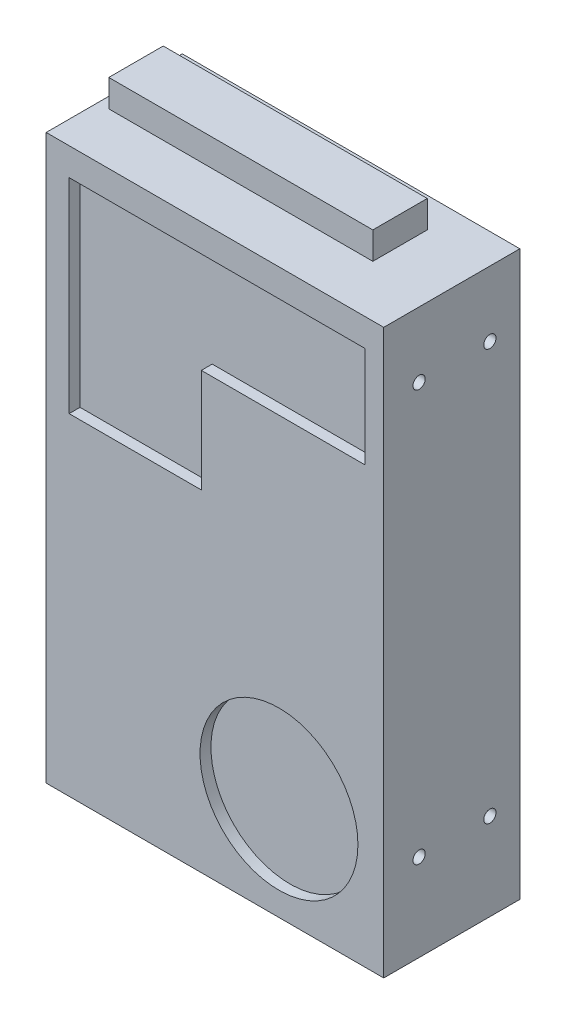
ISO-10303-21;
HEADER;
FILE_DESCRIPTION(('STEP AP214'),'2;1');
FILE_NAME('part.step','',(''),(''),'','','');
FILE_SCHEMA(('AUTOMOTIVE_DESIGN { 1 0 10303 214 1 1 1 1 }'));
ENDSEC;
DATA;
#1=APPLICATION_CONTEXT('core data for automotive mechanical design processes');
#2=APPLICATION_PROTOCOL_DEFINITION('international standard','automotive_design',2000,#1);
#3=PRODUCT_CONTEXT('',#1,'mechanical');
#4=PRODUCT('Part','Part','',(#3));
#5=PRODUCT_RELATED_PRODUCT_CATEGORY('part','',(#4));
#6=PRODUCT_DEFINITION_FORMATION('','',#4);
#7=PRODUCT_DEFINITION_CONTEXT('part definition',#1,'design');
#8=PRODUCT_DEFINITION('design','',#6,#7);
#9=PRODUCT_DEFINITION_SHAPE('','',#8);
#10=(LENGTH_UNIT() NAMED_UNIT(*) SI_UNIT(.MILLI.,.METRE.));
#11=(NAMED_UNIT(*) PLANE_ANGLE_UNIT() SI_UNIT($,.RADIAN.));
#12=(NAMED_UNIT(*) SI_UNIT($,.STERADIAN.) SOLID_ANGLE_UNIT());
#13=UNCERTAINTY_MEASURE_WITH_UNIT(LENGTH_MEASURE(1.E-05),#10,'distance_accuracy_value','');
#14=(GEOMETRIC_REPRESENTATION_CONTEXT(3) GLOBAL_UNCERTAINTY_ASSIGNED_CONTEXT((#13)) GLOBAL_UNIT_ASSIGNED_CONTEXT((#10,
#11,#12)) REPRESENTATION_CONTEXT('',''));
#15=CARTESIAN_POINT('',(0.,0.,0.));
#16=DIRECTION('',(0.,0.,1.));
#17=DIRECTION('',(1.,0.,0.));
#18=AXIS2_PLACEMENT_3D('',#15,#16,#17);
#19=CARTESIAN_POINT('',(-25.0000000000016,-80.5,15.));
#20=DIRECTION('',(0.,0.,-1.));
#21=DIRECTION('',(-1.,0.,0.));
#22=AXIS2_PLACEMENT_3D('',#19,#20,#21);
#23=CYLINDRICAL_SURFACE('',#22,2.25);
#24=CARTESIAN_POINT('',(-25.0000000000016,-80.5,0.));
#25=DIRECTION('',(0.,0.,-1.));
#26=DIRECTION('',(-1.,0.,0.));
#27=AXIS2_PLACEMENT_3D('',#24,#25,#26);
#28=CIRCLE('',#27,2.25);
#29=CARTESIAN_POINT('',(-27.2500000000016,-80.5,0.));
#30=VERTEX_POINT('',#29);
#31=EDGE_CURVE('E314',#30,#30,#28,.T.);
#32=ORIENTED_EDGE('',*,*,#31,.T.);
#33=EDGE_LOOP('',(#32));
#34=FACE_BOUND('',#33,.T.);
#35=CARTESIAN_POINT('',(-25.0000000000016,-80.5,11.0000000000016));
#36=DIRECTION('',(0.707106781186547,0.,-0.707106781186547));
#37=DIRECTION('',(-0.707106781186547,0.,-0.707106781186547));
#38=AXIS2_PLACEMENT_3D('',#35,#36,#37);
#39=ELLIPSE('',#38,3.18198051533947,2.25);
#40=CARTESIAN_POINT('',(-25.0000000000016,-78.25,11.0000000000016));
#41=VERTEX_POINT('',#40);
#42=CARTESIAN_POINT('',(-25.0000000000016,-82.75,11.0000000000016));
#43=VERTEX_POINT('',#42);
#44=EDGE_CURVE('E47',#41,#43,#39,.F.);
#45=ORIENTED_EDGE('',*,*,#44,.T.);
#46=CARTESIAN_POINT('',(-25.0000000000016,-80.5,11.0000000000016));
#47=DIRECTION('',(-0.707106781186547,0.,-0.707106781186547));
#48=DIRECTION('',(0.707106781186547,0.,-0.707106781186547));
#49=AXIS2_PLACEMENT_3D('',#46,#47,#48);
#50=ELLIPSE('',#49,3.18198051533947,2.25);
#51=EDGE_CURVE('E352',#43,#41,#50,.F.);
#52=ORIENTED_EDGE('',*,*,#51,.T.);
#53=EDGE_LOOP('',(#45,#52));
#54=FACE_BOUND('',#53,.T.);
#55=ADVANCED_FACE('F33',(#34,#54),#23,.F.);
#56=CARTESIAN_POINT('',(24.9999999999984,-80.5,15.));
#57=DIRECTION('',(0.,0.,-1.));
#58=DIRECTION('',(-1.,0.,0.));
#59=AXIS2_PLACEMENT_3D('',#56,#57,#58);
#60=CYLINDRICAL_SURFACE('',#59,2.25);
#61=CARTESIAN_POINT('',(24.9999999999984,-80.5,0.));
#62=DIRECTION('',(0.,0.,-1.));
#63=DIRECTION('',(-1.,0.,0.));
#64=AXIS2_PLACEMENT_3D('',#61,#62,#63);
#65=CIRCLE('',#64,2.25);
#66=CARTESIAN_POINT('',(22.7499999999984,-80.5,0.));
#67=VERTEX_POINT('',#66);
#68=EDGE_CURVE('E320',#67,#67,#65,.T.);
#69=ORIENTED_EDGE('',*,*,#68,.T.);
#70=EDGE_LOOP('',(#69));
#71=FACE_BOUND('',#70,.T.);
#72=CARTESIAN_POINT('',(24.9999999999984,-80.5,11.0000000000016));
#73=DIRECTION('',(0.707106781186547,0.,-0.707106781186547));
#74=DIRECTION('',(-0.707106781186547,0.,-0.707106781186547));
#75=AXIS2_PLACEMENT_3D('',#72,#73,#74);
#76=ELLIPSE('',#75,3.18198051533947,2.25);
#77=CARTESIAN_POINT('',(24.9999999999984,-78.25,11.0000000000016));
#78=VERTEX_POINT('',#77);
#79=CARTESIAN_POINT('',(24.9999999999984,-82.75,11.0000000000016));
#80=VERTEX_POINT('',#79);
#81=EDGE_CURVE('E53',#78,#80,#76,.F.);
#82=ORIENTED_EDGE('',*,*,#81,.T.);
#83=CARTESIAN_POINT('',(24.9999999999984,-80.5,11.0000000000016));
#84=DIRECTION('',(-0.707106781186547,0.,-0.707106781186547));
#85=DIRECTION('',(0.707106781186547,0.,-0.707106781186547));
#86=AXIS2_PLACEMENT_3D('',#83,#84,#85);
#87=ELLIPSE('',#86,3.18198051533947,2.25);
#88=EDGE_CURVE('E11',#80,#78,#87,.F.);
#89=ORIENTED_EDGE('',*,*,#88,.T.);
#90=EDGE_LOOP('',(#82,#89));
#91=FACE_BOUND('',#90,.T.);
#92=ADVANCED_FACE('F169',(#71,#91),#60,.F.);
#93=CARTESIAN_POINT('',(25.,70.5,15.));
#94=DIRECTION('',(0.,0.,-1.));
#95=DIRECTION('',(-1.,0.,0.));
#96=AXIS2_PLACEMENT_3D('',#93,#94,#95);
#97=CYLINDRICAL_SURFACE('',#96,2.25);
#98=CARTESIAN_POINT('',(25.,70.5,0.));
#99=DIRECTION('',(0.,0.,-1.));
#100=DIRECTION('',(-1.,0.,0.));
#101=AXIS2_PLACEMENT_3D('',#98,#99,#100);
#102=CIRCLE('',#101,2.25);
#103=CARTESIAN_POINT('',(22.75,70.5,0.));
#104=VERTEX_POINT('',#103);
#105=EDGE_CURVE('E302',#104,#104,#102,.T.);
#106=ORIENTED_EDGE('',*,*,#105,.T.);
#107=EDGE_LOOP('',(#106));
#108=FACE_BOUND('',#107,.T.);
#109=CARTESIAN_POINT('',(25.,70.5,11.));
#110=DIRECTION('',(0.707106781186547,0.,-0.707106781186547));
#111=DIRECTION('',(-0.707106781186547,0.,-0.707106781186547));
#112=AXIS2_PLACEMENT_3D('',#109,#110,#111);
#113=ELLIPSE('',#112,3.18198051533947,2.25);
#114=CARTESIAN_POINT('',(25.,72.75,11.));
#115=VERTEX_POINT('',#114);
#116=CARTESIAN_POINT('',(25.,68.25,11.));
#117=VERTEX_POINT('',#116);
#118=EDGE_CURVE('E334',#115,#117,#113,.F.);
#119=ORIENTED_EDGE('',*,*,#118,.T.);
#120=CARTESIAN_POINT('',(25.,70.5,11.));
#121=DIRECTION('',(-0.707106781186547,0.,-0.707106781186547));
#122=DIRECTION('',(0.707106781186547,0.,-0.707106781186547));
#123=AXIS2_PLACEMENT_3D('',#120,#121,#122);
#124=ELLIPSE('',#123,3.18198051533947,2.25);
#125=EDGE_CURVE('E323',#117,#115,#124,.F.);
#126=ORIENTED_EDGE('',*,*,#125,.T.);
#127=EDGE_LOOP('',(#119,#126));
#128=FACE_BOUND('',#127,.T.);
#129=ADVANCED_FACE('F393',(#108,#128),#97,.F.);
#130=CARTESIAN_POINT('',(-25.,70.5,15.));
#131=DIRECTION('',(0.,0.,-1.));
#132=DIRECTION('',(-1.,0.,0.));
#133=AXIS2_PLACEMENT_3D('',#130,#131,#132);
#134=CYLINDRICAL_SURFACE('',#133,2.25);
#135=CARTESIAN_POINT('',(-25.,70.5,0.));
#136=DIRECTION('',(0.,0.,-1.));
#137=DIRECTION('',(-1.,0.,0.));
#138=AXIS2_PLACEMENT_3D('',#135,#136,#137);
#139=CIRCLE('',#138,2.25);
#140=CARTESIAN_POINT('',(-27.25,70.5,0.));
#141=VERTEX_POINT('',#140);
#142=EDGE_CURVE('E308',#141,#141,#139,.T.);
#143=ORIENTED_EDGE('',*,*,#142,.T.);
#144=EDGE_LOOP('',(#143));
#145=FACE_BOUND('',#144,.T.);
#146=CARTESIAN_POINT('',(-25.,70.5,11.));
#147=DIRECTION('',(0.707106781186547,0.,-0.707106781186547));
#148=DIRECTION('',(-0.707106781186547,0.,-0.707106781186547));
#149=AXIS2_PLACEMENT_3D('',#146,#147,#148);
#150=ELLIPSE('',#149,3.18198051533947,2.25);
#151=CARTESIAN_POINT('',(-25.,72.75,11.));
#152=VERTEX_POINT('',#151);
#153=CARTESIAN_POINT('',(-25.,68.25,11.));
#154=VERTEX_POINT('',#153);
#155=EDGE_CURVE('E181',#152,#154,#150,.F.);
#156=ORIENTED_EDGE('',*,*,#155,.T.);
#157=CARTESIAN_POINT('',(-25.,70.5,11.));
#158=DIRECTION('',(-0.707106781186547,0.,-0.707106781186547));
#159=DIRECTION('',(0.707106781186547,0.,-0.707106781186547));
#160=AXIS2_PLACEMENT_3D('',#157,#158,#159);
#161=ELLIPSE('',#160,3.18198051533947,2.25);
#162=EDGE_CURVE('E167',#154,#152,#161,.F.);
#163=ORIENTED_EDGE('',*,*,#162,.T.);
#164=EDGE_LOOP('',(#156,#163));
#165=FACE_BOUND('',#164,.T.);
#166=ADVANCED_FACE('F472',(#145,#165),#134,.F.);
#167=CARTESIAN_POINT('',(-72.019317075191,94.5,0.));
#168=DIRECTION('',(0.,-1.,0.));
#169=DIRECTION('',(0.,0.,-1.));
#170=AXIS2_PLACEMENT_3D('',#167,#168,#169);
#171=PLANE('',#170);
#172=DIRECTION('',(1.,0.,0.));
#173=VECTOR('',#172,1.);
#174=CARTESIAN_POINT('',(0.,94.5,0.));
#175=LINE('',#174,#173);
#176=CARTESIAN_POINT('',(-62.,94.5,0.));
#177=VERTEX_POINT('',#176);
#178=CARTESIAN_POINT('',(62.,94.5,0.));
#179=VERTEX_POINT('',#178);
#180=EDGE_CURVE('E183',#177,#179,#175,.T.);
#181=ORIENTED_EDGE('',*,*,#180,.F.);
#182=DIRECTION('',(0.,0.,-1.));
#183=VECTOR('',#182,1.);
#184=CARTESIAN_POINT('',(-62.,94.5,50.));
#185=LINE('',#184,#183);
#186=CARTESIAN_POINT('',(-62.,94.5,50.));
#187=VERTEX_POINT('',#186);
#188=EDGE_CURVE('E209',#187,#177,#185,.T.);
#189=ORIENTED_EDGE('',*,*,#188,.F.);
#190=DIRECTION('',(1.,0.,0.));
#191=VECTOR('',#190,1.);
#192=CARTESIAN_POINT('',(-72.019317075191,94.5,50.));
#193=LINE('',#192,#191);
#194=CARTESIAN_POINT('',(62.,94.5,50.));
#195=VERTEX_POINT('',#194);
#196=EDGE_CURVE('E212',#187,#195,#193,.T.);
#197=ORIENTED_EDGE('',*,*,#196,.T.);
#198=DIRECTION('',(0.,0.,1.));
#199=VECTOR('',#198,1.);
#200=CARTESIAN_POINT('',(62.,94.5,50.));
#201=LINE('',#200,#199);
#202=EDGE_CURVE('E201',#179,#195,#201,.T.);
#203=ORIENTED_EDGE('',*,*,#202,.F.);
#204=EDGE_LOOP('',(#181,#189,#197,#203));
#205=FACE_BOUND('',#204,.T.);
#206=DIRECTION('',(0.,0.,1.));
#207=VECTOR('',#206,1.);
#208=CARTESIAN_POINT('',(-58.,94.5,11.));
#209=LINE('',#208,#207);
#210=CARTESIAN_POINT('',(-58.,94.5,11.));
#211=VERTEX_POINT('',#210);
#212=CARTESIAN_POINT('',(-58.,94.5,31.));
#213=VERTEX_POINT('',#212);
#214=EDGE_CURVE('E237',#211,#213,#209,.T.);
#215=ORIENTED_EDGE('',*,*,#214,.F.);
#216=DIRECTION('',(-1.,0.,0.));
#217=VECTOR('',#216,1.);
#218=CARTESIAN_POINT('',(-58.,94.5,11.));
#219=LINE('',#218,#217);
#220=CARTESIAN_POINT('',(39.,94.5,11.));
#221=VERTEX_POINT('',#220);
#222=EDGE_CURVE('E227',#221,#211,#219,.T.);
#223=ORIENTED_EDGE('',*,*,#222,.F.);
#224=DIRECTION('',(0.,0.,-1.));
#225=VECTOR('',#224,1.);
#226=CARTESIAN_POINT('',(39.,94.5,11.));
#227=LINE('',#226,#225);
#228=CARTESIAN_POINT('',(39.,94.5,31.));
#229=VERTEX_POINT('',#228);
#230=EDGE_CURVE('E231',#229,#221,#227,.T.);
#231=ORIENTED_EDGE('',*,*,#230,.F.);
#232=DIRECTION('',(1.,0.,0.));
#233=VECTOR('',#232,1.);
#234=CARTESIAN_POINT('',(-58.,94.5,31.));
#235=LINE('',#234,#233);
#236=EDGE_CURVE('E234',#213,#229,#235,.T.);
#237=ORIENTED_EDGE('',*,*,#236,.F.);
#238=EDGE_LOOP('',(#215,#223,#231,#237));
#239=FACE_BOUND('',#238,.T.);
#240=ADVANCED_FACE('F450',(#205,#239),#171,.F.);
#241=CARTESIAN_POINT('',(62.,112.5,50.));
#242=DIRECTION('',(-1.,0.,0.));
#243=DIRECTION('',(0.,-1.,0.));
#244=AXIS2_PLACEMENT_3D('',#241,#242,#243);
#245=PLANE('',#244);
#246=CARTESIAN_POINT('',(62.,-80.5,11.0000000000016));
#247=DIRECTION('',(-1.,0.,0.));
#248=DIRECTION('',(0.,-1.,0.));
#249=AXIS2_PLACEMENT_3D('',#246,#247,#248);
#250=CIRCLE('',#249,2.25);
#251=CARTESIAN_POINT('',(62.,-82.75,11.0000000000016));
#252=VERTEX_POINT('',#251);
#253=EDGE_CURVE('E363',#252,#252,#250,.T.);
#254=ORIENTED_EDGE('',*,*,#253,.T.);
#255=EDGE_LOOP('',(#254));
#256=FACE_BOUND('',#255,.T.);
#257=CARTESIAN_POINT('',(62.,-80.5,37.0000000000016));
#258=DIRECTION('',(-1.,0.,0.));
#259=DIRECTION('',(0.,-1.,0.));
#260=AXIS2_PLACEMENT_3D('',#257,#258,#259);
#261=CIRCLE('',#260,2.25);
#262=CARTESIAN_POINT('',(62.,-82.75,37.0000000000016));
#263=VERTEX_POINT('',#262);
#264=EDGE_CURVE('E346',#263,#263,#261,.T.);
#265=ORIENTED_EDGE('',*,*,#264,.T.);
#266=EDGE_LOOP('',(#265));
#267=FACE_BOUND('',#266,.T.);
#268=CARTESIAN_POINT('',(62.,70.5,37.));
#269=DIRECTION('',(-1.,0.,0.));
#270=DIRECTION('',(0.,-1.,0.));
#271=AXIS2_PLACEMENT_3D('',#268,#269,#270);
#272=CIRCLE('',#271,2.25);
#273=CARTESIAN_POINT('',(62.,68.25,37.));
#274=VERTEX_POINT('',#273);
#275=EDGE_CURVE('E340',#274,#274,#272,.T.);
#276=ORIENTED_EDGE('',*,*,#275,.T.);
#277=EDGE_LOOP('',(#276));
#278=FACE_BOUND('',#277,.T.);
#279=CARTESIAN_POINT('',(62.,70.5,11.));
#280=DIRECTION('',(-1.,0.,0.));
#281=DIRECTION('',(0.,-1.,0.));
#282=AXIS2_PLACEMENT_3D('',#279,#280,#281);
#283=CIRCLE('',#282,2.25);
#284=CARTESIAN_POINT('',(62.,68.25,11.));
#285=VERTEX_POINT('',#284);
#286=EDGE_CURVE('E336',#285,#285,#283,.T.);
#287=ORIENTED_EDGE('',*,*,#286,.T.);
#288=EDGE_LOOP('',(#287));
#289=FACE_BOUND('',#288,.T.);
#290=DIRECTION('',(0.,1.,0.));
#291=VECTOR('',#290,1.);
#292=CARTESIAN_POINT('',(62.,112.5,0.));
#293=LINE('',#292,#291);
#294=CARTESIAN_POINT('',(62.,-112.5,0.));
#295=VERTEX_POINT('',#294);
#296=EDGE_CURVE('E198',#295,#179,#293,.T.);
#297=ORIENTED_EDGE('',*,*,#296,.T.);
#298=ORIENTED_EDGE('',*,*,#202,.T.);
#299=DIRECTION('',(0.,1.,0.));
#300=VECTOR('',#299,1.);
#301=CARTESIAN_POINT('',(62.,112.5,50.));
#302=LINE('',#301,#300);
#303=CARTESIAN_POINT('',(62.,-112.5,50.));
#304=VERTEX_POINT('',#303);
#305=EDGE_CURVE('E195',#304,#195,#302,.T.);
#306=ORIENTED_EDGE('',*,*,#305,.F.);
#307=DIRECTION('',(0.,0.,-1.));
#308=VECTOR('',#307,1.);
#309=CARTESIAN_POINT('',(62.,-112.5,50.));
#310=LINE('',#309,#308);
#311=EDGE_CURVE('E189',#304,#295,#310,.T.);
#312=ORIENTED_EDGE('',*,*,#311,.T.);
#313=EDGE_LOOP('',(#297,#298,#306,#312));
#314=FACE_BOUND('',#313,.T.);
#315=ADVANCED_FACE('F35',(#256,#267,#278,#289,#314),#245,.F.);
#316=CARTESIAN_POINT('',(-62.,112.5,50.));
#317=DIRECTION('',(1.,0.,0.));
#318=DIRECTION('',(0.,1.,0.));
#319=AXIS2_PLACEMENT_3D('',#316,#317,#318);
#320=PLANE('',#319);
#321=CARTESIAN_POINT('',(-62.,-80.5,11.0000000000016));
#322=DIRECTION('',(-1.,0.,0.));
#323=DIRECTION('',(0.,-1.,0.));
#324=AXIS2_PLACEMENT_3D('',#321,#322,#323);
#325=CIRCLE('',#324,2.25);
#326=CARTESIAN_POINT('',(-62.,-82.75,11.0000000000016));
#327=VERTEX_POINT('',#326);
#328=EDGE_CURVE('E364',#327,#327,#325,.T.);
#329=ORIENTED_EDGE('',*,*,#328,.F.);
#330=EDGE_LOOP('',(#329));
#331=FACE_BOUND('',#330,.T.);
#332=CARTESIAN_POINT('',(-62.,-80.5,37.0000000000016));
#333=DIRECTION('',(-1.,0.,0.));
#334=DIRECTION('',(0.,-1.,0.));
#335=AXIS2_PLACEMENT_3D('',#332,#333,#334);
#336=CIRCLE('',#335,2.25);
#337=CARTESIAN_POINT('',(-62.,-82.75,37.0000000000016));
#338=VERTEX_POINT('',#337);
#339=EDGE_CURVE('E349',#338,#338,#336,.T.);
#340=ORIENTED_EDGE('',*,*,#339,.F.);
#341=EDGE_LOOP('',(#340));
#342=FACE_BOUND('',#341,.T.);
#343=CARTESIAN_POINT('',(-62.,70.5,37.));
#344=DIRECTION('',(-1.,0.,0.));
#345=DIRECTION('',(0.,-1.,0.));
#346=AXIS2_PLACEMENT_3D('',#343,#344,#345);
#347=CIRCLE('',#346,2.25);
#348=CARTESIAN_POINT('',(-62.,68.25,37.));
#349=VERTEX_POINT('',#348);
#350=EDGE_CURVE('E343',#349,#349,#347,.T.);
#351=ORIENTED_EDGE('',*,*,#350,.F.);
#352=EDGE_LOOP('',(#351));
#353=FACE_BOUND('',#352,.T.);
#354=CARTESIAN_POINT('',(-62.,70.5,11.));
#355=DIRECTION('',(-1.,0.,0.));
#356=DIRECTION('',(0.,-1.,0.));
#357=AXIS2_PLACEMENT_3D('',#354,#355,#356);
#358=CIRCLE('',#357,2.25);
#359=CARTESIAN_POINT('',(-62.,68.25,11.));
#360=VERTEX_POINT('',#359);
#361=EDGE_CURVE('E337',#360,#360,#358,.T.);
#362=ORIENTED_EDGE('',*,*,#361,.F.);
#363=EDGE_LOOP('',(#362));
#364=FACE_BOUND('',#363,.T.);
#365=DIRECTION('',(0.,-1.,0.));
#366=VECTOR('',#365,1.);
#367=CARTESIAN_POINT('',(-62.,112.5,50.));
#368=LINE('',#367,#366);
#369=CARTESIAN_POINT('',(-62.,-112.5,50.));
#370=VERTEX_POINT('',#369);
#371=EDGE_CURVE('E203',#187,#370,#368,.T.);
#372=ORIENTED_EDGE('',*,*,#371,.F.);
#373=ORIENTED_EDGE('',*,*,#188,.T.);
#374=DIRECTION('',(0.,-1.,0.));
#375=VECTOR('',#374,1.);
#376=CARTESIAN_POINT('',(-62.,112.5,0.));
#377=LINE('',#376,#375);
#378=CARTESIAN_POINT('',(-62.,-112.5,0.));
#379=VERTEX_POINT('',#378);
#380=EDGE_CURVE('E196',#177,#379,#377,.T.);
#381=ORIENTED_EDGE('',*,*,#380,.T.);
#382=DIRECTION('',(0.,0.,-1.));
#383=VECTOR('',#382,1.);
#384=CARTESIAN_POINT('',(-62.,-112.5,50.));
#385=LINE('',#384,#383);
#386=EDGE_CURVE('E186',#370,#379,#385,.T.);
#387=ORIENTED_EDGE('',*,*,#386,.F.);
#388=EDGE_LOOP('',(#372,#373,#381,#387));
#389=FACE_BOUND('',#388,.T.);
#390=ADVANCED_FACE('F431',(#331,#342,#353,#364,#389),#320,.F.);
#391=CARTESIAN_POINT('',(-62.,-112.5,50.));
#392=DIRECTION('',(0.,1.,0.));
#393=DIRECTION('',(0.,0.,1.));
#394=AXIS2_PLACEMENT_3D('',#391,#392,#393);
#395=PLANE('',#394);
#396=DIRECTION('',(1.,0.,0.));
#397=VECTOR('',#396,1.);
#398=CARTESIAN_POINT('',(-62.,-112.5,0.));
#399=LINE('',#398,#397);
#400=EDGE_CURVE('E193',#379,#295,#399,.T.);
#401=ORIENTED_EDGE('',*,*,#400,.T.);
#402=ORIENTED_EDGE('',*,*,#311,.F.);
#403=DIRECTION('',(1.,0.,0.));
#404=VECTOR('',#403,1.);
#405=CARTESIAN_POINT('',(-62.,-112.5,50.));
#406=LINE('',#405,#404);
#407=EDGE_CURVE('E192',#370,#304,#406,.T.);
#408=ORIENTED_EDGE('',*,*,#407,.F.);
#409=ORIENTED_EDGE('',*,*,#386,.T.);
#410=EDGE_LOOP('',(#401,#402,#408,#409));
#411=FACE_BOUND('',#410,.T.);
#412=ADVANCED_FACE('F434',(#411),#395,.F.);
#413=CARTESIAN_POINT('',(0.,0.,50.));
#414=DIRECTION('',(0.,0.,1.));
#415=DIRECTION('',(1.,0.,0.));
#416=AXIS2_PLACEMENT_3D('',#413,#414,#415);
#417=PLANE('',#416);
#418=DIRECTION('',(0.,1.,0.));
#419=VECTOR('',#418,1.);
#420=CARTESIAN_POINT('',(-5.00532483606775,47.3045795696944,50.));
#421=LINE('',#420,#419);
#422=CARTESIAN_POINT('',(-5.00532483606775,9.26411081557963,50.));
#423=VERTEX_POINT('',#422);
#424=CARTESIAN_POINT('',(-5.00532483606775,47.3045795696944,50.));
#425=VERTEX_POINT('',#424);
#426=EDGE_CURVE('E283',#423,#425,#421,.T.);
#427=ORIENTED_EDGE('',*,*,#426,.F.);
#428=DIRECTION('',(1.,0.,0.));
#429=VECTOR('',#428,1.);
#430=CARTESIAN_POINT('',(-53.5569757459248,9.26411081557963,50.));
#431=LINE('',#430,#429);
#432=CARTESIAN_POINT('',(-53.5569757459248,9.26411081557963,50.));
#433=VERTEX_POINT('',#432);
#434=EDGE_CURVE('E267',#433,#423,#431,.T.);
#435=ORIENTED_EDGE('',*,*,#434,.F.);
#436=DIRECTION('',(0.,-1.,0.));
#437=VECTOR('',#436,1.);
#438=CARTESIAN_POINT('',(-53.5569757459248,84.3439833565956,50.));
#439=LINE('',#438,#437);
#440=CARTESIAN_POINT('',(-53.5569757459248,84.3439833565956,50.));
#441=VERTEX_POINT('',#440);
#442=EDGE_CURVE('E271',#441,#433,#439,.T.);
#443=ORIENTED_EDGE('',*,*,#442,.F.);
#444=DIRECTION('',(-1.,0.,0.));
#445=VECTOR('',#444,1.);
#446=CARTESIAN_POINT('',(-53.5569757459248,84.3439833565956,50.));
#447=LINE('',#446,#445);
#448=CARTESIAN_POINT('',(55.058573196745,84.3439833565956,50.));
#449=VERTEX_POINT('',#448);
#450=EDGE_CURVE('E274',#449,#441,#447,.T.);
#451=ORIENTED_EDGE('',*,*,#450,.F.);
#452=DIRECTION('',(0.,1.,0.));
#453=VECTOR('',#452,1.);
#454=CARTESIAN_POINT('',(55.058573196745,84.3439833565956,50.));
#455=LINE('',#454,#453);
#456=CARTESIAN_POINT('',(55.058573196745,47.3045795696944,50.));
#457=VERTEX_POINT('',#456);
#458=EDGE_CURVE('E277',#457,#449,#455,.T.);
#459=ORIENTED_EDGE('',*,*,#458,.F.);
#460=DIRECTION('',(1.,0.,0.));
#461=VECTOR('',#460,1.);
#462=CARTESIAN_POINT('',(-5.00532483606775,47.3045795696944,50.));
#463=LINE('',#462,#461);
#464=EDGE_CURVE('E280',#425,#457,#463,.T.);
#465=ORIENTED_EDGE('',*,*,#464,.F.);
#466=EDGE_LOOP('',(#427,#435,#443,#451,#459,#465));
#467=FACE_BOUND('',#466,.T.);
#468=CARTESIAN_POINT('',(23.5250267295183,-74.8253464303583,50.));
#469=DIRECTION('',(0.,0.,1.));
#470=DIRECTION('',(1.,0.,0.));
#471=AXIS2_PLACEMENT_3D('',#468,#469,#470);
#472=CIRCLE('',#471,29.);
#473=CARTESIAN_POINT('',(52.5250267295183,-74.8253464303583,50.));
#474=VERTEX_POINT('',#473);
#475=EDGE_CURVE('E248',#474,#474,#472,.T.);
#476=ORIENTED_EDGE('',*,*,#475,.F.);
#477=EDGE_LOOP('',(#476));
#478=FACE_BOUND('',#477,.T.);
#479=ORIENTED_EDGE('',*,*,#196,.F.);
#480=ORIENTED_EDGE('',*,*,#371,.T.);
#481=ORIENTED_EDGE('',*,*,#407,.T.);
#482=ORIENTED_EDGE('',*,*,#305,.T.);
#483=EDGE_LOOP('',(#479,#480,#481,#482));
#484=FACE_BOUND('',#483,.T.);
#485=ADVANCED_FACE('F446',(#467,#478,#484),#417,.T.);
#486=CARTESIAN_POINT('',(0.,0.,0.));
#487=DIRECTION('',(0.,0.,1.));
#488=DIRECTION('',(1.,0.,0.));
#489=AXIS2_PLACEMENT_3D('',#486,#487,#488);
#490=PLANE('',#489);
#491=ORIENTED_EDGE('',*,*,#68,.F.);
#492=EDGE_LOOP('',(#491));
#493=FACE_BOUND('',#492,.T.);
#494=ORIENTED_EDGE('',*,*,#31,.F.);
#495=EDGE_LOOP('',(#494));
#496=FACE_BOUND('',#495,.T.);
#497=ORIENTED_EDGE('',*,*,#142,.F.);
#498=EDGE_LOOP('',(#497));
#499=FACE_BOUND('',#498,.T.);
#500=ORIENTED_EDGE('',*,*,#105,.F.);
#501=EDGE_LOOP('',(#500));
#502=FACE_BOUND('',#501,.T.);
#503=ORIENTED_EDGE('',*,*,#380,.F.);
#504=ORIENTED_EDGE('',*,*,#180,.T.);
#505=ORIENTED_EDGE('',*,*,#296,.F.);
#506=ORIENTED_EDGE('',*,*,#400,.F.);
#507=EDGE_LOOP('',(#503,#504,#505,#506));
#508=FACE_BOUND('',#507,.T.);
#509=ADVANCED_FACE('F456',(#493,#496,#499,#502,#508),#490,.F.);
#510=CARTESIAN_POINT('',(-58.,104.5,11.));
#511=DIRECTION('',(1.,0.,0.));
#512=DIRECTION('',(0.,0.,-1.));
#513=AXIS2_PLACEMENT_3D('',#510,#511,#512);
#514=PLANE('',#513);
#515=ORIENTED_EDGE('',*,*,#214,.T.);
#516=DIRECTION('',(0.,-1.,0.));
#517=VECTOR('',#516,1.);
#518=CARTESIAN_POINT('',(-58.,104.5,31.));
#519=LINE('',#518,#517);
#520=CARTESIAN_POINT('',(-58.,104.5,31.));
#521=VERTEX_POINT('',#520);
#522=EDGE_CURVE('E214',#521,#213,#519,.T.);
#523=ORIENTED_EDGE('',*,*,#522,.F.);
#524=DIRECTION('',(0.,0.,1.));
#525=VECTOR('',#524,1.);
#526=CARTESIAN_POINT('',(-58.,104.5,11.));
#527=LINE('',#526,#525);
#528=CARTESIAN_POINT('',(-58.,104.5,11.));
#529=VERTEX_POINT('',#528);
#530=EDGE_CURVE('E230',#529,#521,#527,.T.);
#531=ORIENTED_EDGE('',*,*,#530,.F.);
#532=DIRECTION('',(0.,-1.,0.));
#533=VECTOR('',#532,1.);
#534=CARTESIAN_POINT('',(-58.,104.5,11.));
#535=LINE('',#534,#533);
#536=EDGE_CURVE('E223',#529,#211,#535,.T.);
#537=ORIENTED_EDGE('',*,*,#536,.T.);
#538=EDGE_LOOP('',(#515,#523,#531,#537));
#539=FACE_BOUND('',#538,.T.);
#540=ADVANCED_FACE('F467',(#539),#514,.F.);
#541=CARTESIAN_POINT('',(-58.,104.5,31.));
#542=DIRECTION('',(0.,0.,-1.));
#543=DIRECTION('',(-1.,0.,0.));
#544=AXIS2_PLACEMENT_3D('',#541,#542,#543);
#545=PLANE('',#544);
#546=ORIENTED_EDGE('',*,*,#236,.T.);
#547=DIRECTION('',(0.,-1.,0.));
#548=VECTOR('',#547,1.);
#549=CARTESIAN_POINT('',(39.,104.5,31.));
#550=LINE('',#549,#548);
#551=CARTESIAN_POINT('',(39.,104.5,31.));
#552=VERTEX_POINT('',#551);
#553=EDGE_CURVE('E217',#552,#229,#550,.T.);
#554=ORIENTED_EDGE('',*,*,#553,.F.);
#555=DIRECTION('',(1.,0.,0.));
#556=VECTOR('',#555,1.);
#557=CARTESIAN_POINT('',(-58.,104.5,31.));
#558=LINE('',#557,#556);
#559=EDGE_CURVE('E244',#521,#552,#558,.T.);
#560=ORIENTED_EDGE('',*,*,#559,.F.);
#561=ORIENTED_EDGE('',*,*,#522,.T.);
#562=EDGE_LOOP('',(#546,#554,#560,#561));
#563=FACE_BOUND('',#562,.T.);
#564=ADVANCED_FACE('F475',(#563),#545,.F.);
#565=CARTESIAN_POINT('',(39.,104.5,11.));
#566=DIRECTION('',(-1.,0.,0.));
#567=DIRECTION('',(0.,0.,1.));
#568=AXIS2_PLACEMENT_3D('',#565,#566,#567);
#569=PLANE('',#568);
#570=ORIENTED_EDGE('',*,*,#230,.T.);
#571=DIRECTION('',(0.,-1.,0.));
#572=VECTOR('',#571,1.);
#573=CARTESIAN_POINT('',(39.,104.5,11.));
#574=LINE('',#573,#572);
#575=CARTESIAN_POINT('',(39.,104.5,11.));
#576=VERTEX_POINT('',#575);
#577=EDGE_CURVE('E220',#576,#221,#574,.T.);
#578=ORIENTED_EDGE('',*,*,#577,.F.);
#579=DIRECTION('',(0.,0.,-1.));
#580=VECTOR('',#579,1.);
#581=CARTESIAN_POINT('',(39.,104.5,11.));
#582=LINE('',#581,#580);
#583=EDGE_CURVE('E242',#552,#576,#582,.T.);
#584=ORIENTED_EDGE('',*,*,#583,.F.);
#585=ORIENTED_EDGE('',*,*,#553,.T.);
#586=EDGE_LOOP('',(#570,#578,#584,#585));
#587=FACE_BOUND('',#586,.T.);
#588=ADVANCED_FACE('F479',(#587),#569,.F.);
#589=CARTESIAN_POINT('',(-58.,104.5,11.));
#590=DIRECTION('',(0.,0.,1.));
#591=DIRECTION('',(1.,0.,0.));
#592=AXIS2_PLACEMENT_3D('',#589,#590,#591);
#593=PLANE('',#592);
#594=ORIENTED_EDGE('',*,*,#222,.T.);
#595=ORIENTED_EDGE('',*,*,#536,.F.);
#596=DIRECTION('',(-1.,0.,0.));
#597=VECTOR('',#596,1.);
#598=CARTESIAN_POINT('',(-58.,104.5,11.));
#599=LINE('',#598,#597);
#600=EDGE_CURVE('E226',#576,#529,#599,.T.);
#601=ORIENTED_EDGE('',*,*,#600,.F.);
#602=ORIENTED_EDGE('',*,*,#577,.T.);
#603=EDGE_LOOP('',(#594,#595,#601,#602));
#604=FACE_BOUND('',#603,.T.);
#605=ADVANCED_FACE('F483',(#604),#593,.F.);
#606=CARTESIAN_POINT('',(0.,104.5,0.));
#607=DIRECTION('',(0.,1.,0.));
#608=DIRECTION('',(0.,0.,1.));
#609=AXIS2_PLACEMENT_3D('',#606,#607,#608);
#610=PLANE('',#609);
#611=ORIENTED_EDGE('',*,*,#530,.T.);
#612=ORIENTED_EDGE('',*,*,#559,.T.);
#613=ORIENTED_EDGE('',*,*,#583,.T.);
#614=ORIENTED_EDGE('',*,*,#600,.T.);
#615=EDGE_LOOP('',(#611,#612,#613,#614));
#616=FACE_BOUND('',#615,.T.);
#617=ADVANCED_FACE('F487',(#616),#610,.T.);
#618=CARTESIAN_POINT('',(23.5250267295183,-74.8253464303583,46.));
#619=DIRECTION('',(0.,0.,1.));
#620=DIRECTION('',(1.,0.,0.));
#621=AXIS2_PLACEMENT_3D('',#618,#619,#620);
#622=CYLINDRICAL_SURFACE('',#621,29.);
#623=CARTESIAN_POINT('',(23.5250267295183,-74.8253464303583,46.));
#624=DIRECTION('',(0.,0.,1.));
#625=DIRECTION('',(1.,0.,0.));
#626=AXIS2_PLACEMENT_3D('',#623,#624,#625);
#627=CIRCLE('',#626,29.);
#628=CARTESIAN_POINT('',(52.5250267295183,-74.8253464303583,46.));
#629=VERTEX_POINT('',#628);
#630=EDGE_CURVE('E240',#629,#629,#627,.T.);
#631=ORIENTED_EDGE('',*,*,#630,.F.);
#632=EDGE_LOOP('',(#631));
#633=FACE_BOUND('',#632,.T.);
#634=ORIENTED_EDGE('',*,*,#475,.T.);
#635=EDGE_LOOP('',(#634));
#636=FACE_BOUND('',#635,.T.);
#637=ADVANCED_FACE('F491',(#633,#636),#622,.F.);
#638=CARTESIAN_POINT('',(23.5250267295183,-74.8253464303583,46.));
#639=DIRECTION('',(0.,0.,1.));
#640=DIRECTION('',(1.,0.,0.));
#641=AXIS2_PLACEMENT_3D('',#638,#639,#640);
#642=PLANE('',#641);
#643=ORIENTED_EDGE('',*,*,#630,.T.);
#644=EDGE_LOOP('',(#643));
#645=FACE_BOUND('',#644,.T.);
#646=ADVANCED_FACE('F495',(#645),#642,.T.);
#647=CARTESIAN_POINT('',(-5.00532483606775,47.3045795696944,46.));
#648=DIRECTION('',(1.,0.,0.));
#649=DIRECTION('',(0.,0.,-1.));
#650=AXIS2_PLACEMENT_3D('',#647,#648,#649);
#651=PLANE('',#650);
#652=ORIENTED_EDGE('',*,*,#426,.T.);
#653=DIRECTION('',(0.,0.,1.));
#654=VECTOR('',#653,1.);
#655=CARTESIAN_POINT('',(-5.00532483606775,47.3045795696944,46.));
#656=LINE('',#655,#654);
#657=CARTESIAN_POINT('',(-5.00532483606775,47.3045795696944,46.));
#658=VERTEX_POINT('',#657);
#659=EDGE_CURVE('E254',#658,#425,#656,.T.);
#660=ORIENTED_EDGE('',*,*,#659,.F.);
#661=DIRECTION('',(0.,1.,0.));
#662=VECTOR('',#661,1.);
#663=CARTESIAN_POINT('',(-5.00532483606775,47.3045795696944,46.));
#664=LINE('',#663,#662);
#665=CARTESIAN_POINT('',(-5.00532483606775,9.26411081557963,46.));
#666=VERTEX_POINT('',#665);
#667=EDGE_CURVE('E270',#666,#658,#664,.T.);
#668=ORIENTED_EDGE('',*,*,#667,.F.);
#669=DIRECTION('',(0.,0.,1.));
#670=VECTOR('',#669,1.);
#671=CARTESIAN_POINT('',(-5.00532483606775,9.26411081557963,46.));
#672=LINE('',#671,#670);
#673=EDGE_CURVE('E251',#666,#423,#672,.T.);
#674=ORIENTED_EDGE('',*,*,#673,.T.);
#675=EDGE_LOOP('',(#652,#660,#668,#674));
#676=FACE_BOUND('',#675,.T.);
#677=ADVANCED_FACE('F499',(#676),#651,.F.);
#678=CARTESIAN_POINT('',(-53.5569757459248,9.26411081557963,46.));
#679=DIRECTION('',(0.,-1.,0.));
#680=DIRECTION('',(0.,0.,-1.));
#681=AXIS2_PLACEMENT_3D('',#678,#679,#680);
#682=PLANE('',#681);
#683=ORIENTED_EDGE('',*,*,#434,.T.);
#684=ORIENTED_EDGE('',*,*,#673,.F.);
#685=DIRECTION('',(1.,0.,0.));
#686=VECTOR('',#685,1.);
#687=CARTESIAN_POINT('',(-53.5569757459248,9.26411081557963,46.));
#688=LINE('',#687,#686);
#689=CARTESIAN_POINT('',(-53.5569757459248,9.26411081557963,46.));
#690=VERTEX_POINT('',#689);
#691=EDGE_CURVE('E258',#690,#666,#688,.T.);
#692=ORIENTED_EDGE('',*,*,#691,.F.);
#693=DIRECTION('',(0.,0.,1.));
#694=VECTOR('',#693,1.);
#695=CARTESIAN_POINT('',(-53.5569757459248,9.26411081557963,46.));
#696=LINE('',#695,#694);
#697=EDGE_CURVE('E264',#690,#433,#696,.T.);
#698=ORIENTED_EDGE('',*,*,#697,.T.);
#699=EDGE_LOOP('',(#683,#684,#692,#698));
#700=FACE_BOUND('',#699,.T.);
#701=ADVANCED_FACE('F503',(#700),#682,.F.);
#702=CARTESIAN_POINT('',(-53.5569757459248,84.3439833565956,46.));
#703=DIRECTION('',(-1.,0.,0.));
#704=DIRECTION('',(0.,0.,1.));
#705=AXIS2_PLACEMENT_3D('',#702,#703,#704);
#706=PLANE('',#705);
#707=ORIENTED_EDGE('',*,*,#442,.T.);
#708=ORIENTED_EDGE('',*,*,#697,.F.);
#709=DIRECTION('',(0.,-1.,0.));
#710=VECTOR('',#709,1.);
#711=CARTESIAN_POINT('',(-53.5569757459248,84.3439833565956,46.));
#712=LINE('',#711,#710);
#713=CARTESIAN_POINT('',(-53.5569757459248,84.3439833565956,46.));
#714=VERTEX_POINT('',#713);
#715=EDGE_CURVE('E288',#714,#690,#712,.T.);
#716=ORIENTED_EDGE('',*,*,#715,.F.);
#717=DIRECTION('',(0.,0.,1.));
#718=VECTOR('',#717,1.);
#719=CARTESIAN_POINT('',(-53.5569757459248,84.3439833565956,46.));
#720=LINE('',#719,#718);
#721=EDGE_CURVE('E262',#714,#441,#720,.T.);
#722=ORIENTED_EDGE('',*,*,#721,.T.);
#723=EDGE_LOOP('',(#707,#708,#716,#722));
#724=FACE_BOUND('',#723,.T.);
#725=ADVANCED_FACE('F517',(#724),#706,.F.);
#726=CARTESIAN_POINT('',(-53.5569757459248,84.3439833565956,46.));
#727=DIRECTION('',(0.,1.,0.));
#728=DIRECTION('',(0.,0.,1.));
#729=AXIS2_PLACEMENT_3D('',#726,#727,#728);
#730=PLANE('',#729);
#731=ORIENTED_EDGE('',*,*,#450,.T.);
#732=ORIENTED_EDGE('',*,*,#721,.F.);
#733=DIRECTION('',(-1.,0.,0.));
#734=VECTOR('',#733,1.);
#735=CARTESIAN_POINT('',(-53.5569757459248,84.3439833565956,46.));
#736=LINE('',#735,#734);
#737=CARTESIAN_POINT('',(55.058573196745,84.3439833565956,46.));
#738=VERTEX_POINT('',#737);
#739=EDGE_CURVE('E291',#738,#714,#736,.T.);
#740=ORIENTED_EDGE('',*,*,#739,.F.);
#741=DIRECTION('',(0.,0.,1.));
#742=VECTOR('',#741,1.);
#743=CARTESIAN_POINT('',(55.058573196745,84.3439833565956,46.));
#744=LINE('',#743,#742);
#745=EDGE_CURVE('E260',#738,#449,#744,.T.);
#746=ORIENTED_EDGE('',*,*,#745,.T.);
#747=EDGE_LOOP('',(#731,#732,#740,#746));
#748=FACE_BOUND('',#747,.T.);
#749=ADVANCED_FACE('F513',(#748),#730,.F.);
#750=CARTESIAN_POINT('',(55.058573196745,84.3439833565956,46.));
#751=DIRECTION('',(1.,0.,0.));
#752=DIRECTION('',(0.,0.,-1.));
#753=AXIS2_PLACEMENT_3D('',#750,#751,#752);
#754=PLANE('',#753);
#755=ORIENTED_EDGE('',*,*,#458,.T.);
#756=ORIENTED_EDGE('',*,*,#745,.F.);
#757=DIRECTION('',(0.,1.,0.));
#758=VECTOR('',#757,1.);
#759=CARTESIAN_POINT('',(55.058573196745,84.3439833565956,46.));
#760=LINE('',#759,#758);
#761=CARTESIAN_POINT('',(55.058573196745,47.3045795696944,46.));
#762=VERTEX_POINT('',#761);
#763=EDGE_CURVE('E294',#762,#738,#760,.T.);
#764=ORIENTED_EDGE('',*,*,#763,.F.);
#765=DIRECTION('',(0.,0.,1.));
#766=VECTOR('',#765,1.);
#767=CARTESIAN_POINT('',(55.058573196745,47.3045795696944,46.));
#768=LINE('',#767,#766);
#769=EDGE_CURVE('E257',#762,#457,#768,.T.);
#770=ORIENTED_EDGE('',*,*,#769,.T.);
#771=EDGE_LOOP('',(#755,#756,#764,#770));
#772=FACE_BOUND('',#771,.T.);
#773=ADVANCED_FACE('F509',(#772),#754,.F.);
#774=CARTESIAN_POINT('',(-5.00532483606775,47.3045795696944,46.));
#775=DIRECTION('',(0.,-1.,0.));
#776=DIRECTION('',(0.,0.,-1.));
#777=AXIS2_PLACEMENT_3D('',#774,#775,#776);
#778=PLANE('',#777);
#779=ORIENTED_EDGE('',*,*,#464,.T.);
#780=ORIENTED_EDGE('',*,*,#769,.F.);
#781=DIRECTION('',(1.,0.,0.));
#782=VECTOR('',#781,1.);
#783=CARTESIAN_POINT('',(-5.00532483606775,47.3045795696944,46.));
#784=LINE('',#783,#782);
#785=EDGE_CURVE('E297',#658,#762,#784,.T.);
#786=ORIENTED_EDGE('',*,*,#785,.F.);
#787=ORIENTED_EDGE('',*,*,#659,.T.);
#788=EDGE_LOOP('',(#779,#780,#786,#787));
#789=FACE_BOUND('',#788,.T.);
#790=ADVANCED_FACE('F505',(#789),#778,.F.);
#791=CARTESIAN_POINT('',(0.,0.,46.));
#792=DIRECTION('',(0.,0.,1.));
#793=DIRECTION('',(1.,0.,0.));
#794=AXIS2_PLACEMENT_3D('',#791,#792,#793);
#795=PLANE('',#794);
#796=ORIENTED_EDGE('',*,*,#667,.T.);
#797=ORIENTED_EDGE('',*,*,#785,.T.);
#798=ORIENTED_EDGE('',*,*,#763,.T.);
#799=ORIENTED_EDGE('',*,*,#739,.T.);
#800=ORIENTED_EDGE('',*,*,#715,.T.);
#801=ORIENTED_EDGE('',*,*,#691,.T.);
#802=EDGE_LOOP('',(#796,#797,#798,#799,#800,#801));
#803=FACE_BOUND('',#802,.T.);
#804=ADVANCED_FACE('F508',(#803),#795,.T.);
#805=CARTESIAN_POINT('',(62.,70.5,11.));
#806=DIRECTION('',(-1.,0.,0.));
#807=DIRECTION('',(0.,-1.,0.));
#808=AXIS2_PLACEMENT_3D('',#805,#806,#807);
#809=CYLINDRICAL_SURFACE('',#808,2.25);
#810=ORIENTED_EDGE('',*,*,#361,.T.);
#811=EDGE_LOOP('',(#810));
#812=FACE_BOUND('',#811,.T.);
#813=ORIENTED_EDGE('',*,*,#155,.F.);
#814=CARTESIAN_POINT('',(-25.,70.5,11.));
#815=DIRECTION('',(-0.707106781186547,0.,-0.707106781186547));
#816=DIRECTION('',(0.707106781186547,0.,-0.707106781186547));
#817=AXIS2_PLACEMENT_3D('',#814,#815,#816);
#818=ELLIPSE('',#817,3.18198051533947,2.25);
#819=EDGE_CURVE('E175',#154,#152,#818,.T.);
#820=ORIENTED_EDGE('',*,*,#819,.F.);
#821=EDGE_LOOP('',(#813,#820));
#822=FACE_BOUND('',#821,.T.);
#823=ADVANCED_FACE('F420',(#812,#822),#809,.F.);
#824=CARTESIAN_POINT('',(-25.,70.5,15.));
#825=DIRECTION('',(0.,0.,-1.));
#826=DIRECTION('',(-1.,0.,0.));
#827=AXIS2_PLACEMENT_3D('',#824,#825,#826);
#828=PLANE('',#827);
#829=CARTESIAN_POINT('',(-25.,70.5,15.));
#830=DIRECTION('',(0.,0.,-1.));
#831=DIRECTION('',(-1.,0.,0.));
#832=AXIS2_PLACEMENT_3D('',#829,#830,#831);
#833=CIRCLE('',#832,2.25);
#834=CARTESIAN_POINT('',(-27.25,70.5,15.));
#835=VERTEX_POINT('',#834);
#836=EDGE_CURVE('E305',#835,#835,#833,.T.);
#837=ORIENTED_EDGE('',*,*,#836,.T.);
#838=EDGE_LOOP('',(#837));
#839=FACE_BOUND('',#838,.T.);
#840=ADVANCED_FACE('F537',(#839),#828,.T.);
#841=CARTESIAN_POINT('',(-25.,70.5,11.));
#842=DIRECTION('',(0.707106781186547,0.,-0.707106781186547));
#843=DIRECTION('',(-0.707106781186547,0.,-0.707106781186547));
#844=AXIS2_PLACEMENT_3D('',#841,#842,#843);
#845=ELLIPSE('',#844,3.18198051533947,2.25);
#846=EDGE_CURVE('E178',#152,#154,#845,.T.);
#847=ORIENTED_EDGE('',*,*,#846,.T.);
#848=ORIENTED_EDGE('',*,*,#819,.T.);
#849=EDGE_LOOP('',(#847,#848));
#850=FACE_BOUND('',#849,.T.);
#851=ORIENTED_EDGE('',*,*,#836,.F.);
#852=EDGE_LOOP('',(#851));
#853=FACE_BOUND('',#852,.T.);
#854=ADVANCED_FACE('F535',(#850,#853),#134,.F.);
#855=ORIENTED_EDGE('',*,*,#846,.F.);
#856=ORIENTED_EDGE('',*,*,#162,.F.);
#857=EDGE_LOOP('',(#855,#856));
#858=FACE_BOUND('',#857,.T.);
#859=ORIENTED_EDGE('',*,*,#118,.F.);
#860=CARTESIAN_POINT('',(25.,70.5,11.));
#861=DIRECTION('',(-0.707106781186547,0.,-0.707106781186547));
#862=DIRECTION('',(0.707106781186547,0.,-0.707106781186547));
#863=AXIS2_PLACEMENT_3D('',#860,#861,#862);
#864=ELLIPSE('',#863,3.18198051533947,2.25);
#865=EDGE_CURVE('E328',#117,#115,#864,.T.);
#866=ORIENTED_EDGE('',*,*,#865,.F.);
#867=EDGE_LOOP('',(#859,#866));
#868=FACE_BOUND('',#867,.T.);
#869=ADVANCED_FACE('F419',(#858,#868),#809,.F.);
#870=CARTESIAN_POINT('',(25.,70.5,15.));
#871=DIRECTION('',(0.,0.,-1.));
#872=DIRECTION('',(-1.,0.,0.));
#873=AXIS2_PLACEMENT_3D('',#870,#871,#872);
#874=PLANE('',#873);
#875=CARTESIAN_POINT('',(25.,70.5,15.));
#876=DIRECTION('',(0.,0.,-1.));
#877=DIRECTION('',(-1.,0.,0.));
#878=AXIS2_PLACEMENT_3D('',#875,#876,#877);
#879=CIRCLE('',#878,2.25);
#880=CARTESIAN_POINT('',(22.75,70.5,15.));
#881=VERTEX_POINT('',#880);
#882=EDGE_CURVE('E285',#881,#881,#879,.T.);
#883=ORIENTED_EDGE('',*,*,#882,.T.);
#884=EDGE_LOOP('',(#883));
#885=FACE_BOUND('',#884,.T.);
#886=ADVANCED_FACE('F530',(#885),#874,.T.);
#887=CARTESIAN_POINT('',(25.,70.5,11.));
#888=DIRECTION('',(0.707106781186547,0.,-0.707106781186547));
#889=DIRECTION('',(-0.707106781186547,0.,-0.707106781186547));
#890=AXIS2_PLACEMENT_3D('',#887,#888,#889);
#891=ELLIPSE('',#890,3.18198051533947,2.25);
#892=EDGE_CURVE('E331',#115,#117,#891,.T.);
#893=ORIENTED_EDGE('',*,*,#892,.T.);
#894=ORIENTED_EDGE('',*,*,#865,.T.);
#895=EDGE_LOOP('',(#893,#894));
#896=FACE_BOUND('',#895,.T.);
#897=ORIENTED_EDGE('',*,*,#882,.F.);
#898=EDGE_LOOP('',(#897));
#899=FACE_BOUND('',#898,.T.);
#900=ADVANCED_FACE('F417',(#896,#899),#97,.F.);
#901=ORIENTED_EDGE('',*,*,#286,.F.);
#902=EDGE_LOOP('',(#901));
#903=FACE_BOUND('',#902,.T.);
#904=ORIENTED_EDGE('',*,*,#892,.F.);
#905=ORIENTED_EDGE('',*,*,#125,.F.);
#906=EDGE_LOOP('',(#904,#905));
#907=FACE_BOUND('',#906,.T.);
#908=ADVANCED_FACE('F413',(#903,#907),#809,.F.);
#909=CARTESIAN_POINT('',(62.,70.5,37.));
#910=DIRECTION('',(-1.,0.,0.));
#911=DIRECTION('',(0.,-1.,0.));
#912=AXIS2_PLACEMENT_3D('',#909,#910,#911);
#913=CYLINDRICAL_SURFACE('',#912,2.25);
#914=ORIENTED_EDGE('',*,*,#275,.F.);
#915=EDGE_LOOP('',(#914));
#916=FACE_BOUND('',#915,.T.);
#917=ORIENTED_EDGE('',*,*,#350,.T.);
#918=EDGE_LOOP('',(#917));
#919=FACE_BOUND('',#918,.T.);
#920=ADVANCED_FACE('F416',(#916,#919),#913,.F.);
#921=CARTESIAN_POINT('',(62.,-80.5,37.0000000000016));
#922=DIRECTION('',(-1.,0.,0.));
#923=DIRECTION('',(0.,-1.,0.));
#924=AXIS2_PLACEMENT_3D('',#921,#922,#923);
#925=CYLINDRICAL_SURFACE('',#924,2.25);
#926=ORIENTED_EDGE('',*,*,#264,.F.);
#927=EDGE_LOOP('',(#926));
#928=FACE_BOUND('',#927,.T.);
#929=ORIENTED_EDGE('',*,*,#339,.T.);
#930=EDGE_LOOP('',(#929));
#931=FACE_BOUND('',#930,.T.);
#932=ADVANCED_FACE('F385',(#928,#931),#925,.F.);
#933=CARTESIAN_POINT('',(62.,-80.5,11.0000000000016));
#934=DIRECTION('',(-1.,0.,0.));
#935=DIRECTION('',(0.,-1.,0.));
#936=AXIS2_PLACEMENT_3D('',#933,#934,#935);
#937=CYLINDRICAL_SURFACE('',#936,2.25);
#938=ORIENTED_EDGE('',*,*,#81,.F.);
#939=CARTESIAN_POINT('',(24.9999999999984,-80.5,11.0000000000016));
#940=DIRECTION('',(-0.707106781186547,0.,-0.707106781186547));
#941=DIRECTION('',(0.707106781186547,0.,-0.707106781186547));
#942=AXIS2_PLACEMENT_3D('',#939,#940,#941);
#943=ELLIPSE('',#942,3.18198051533947,2.25);
#944=EDGE_CURVE('E41',#80,#78,#943,.T.);
#945=ORIENTED_EDGE('',*,*,#944,.F.);
#946=EDGE_LOOP('',(#938,#945));
#947=FACE_BOUND('',#946,.T.);
#948=CARTESIAN_POINT('',(-25.0000000000016,-80.5,11.0000000000016));
#949=DIRECTION('',(0.707106781186547,0.,-0.707106781186547));
#950=DIRECTION('',(-0.707106781186547,0.,-0.707106781186547));
#951=AXIS2_PLACEMENT_3D('',#948,#949,#950);
#952=ELLIPSE('',#951,3.18198051533947,2.25);
#953=EDGE_CURVE('E359',#41,#43,#952,.T.);
#954=ORIENTED_EDGE('',*,*,#953,.F.);
#955=ORIENTED_EDGE('',*,*,#51,.F.);
#956=EDGE_LOOP('',(#954,#955));
#957=FACE_BOUND('',#956,.T.);
#958=ADVANCED_FACE('F165',(#947,#957),#937,.F.);
#959=CARTESIAN_POINT('',(24.9999999999984,-80.5,15.));
#960=DIRECTION('',(0.,0.,-1.));
#961=DIRECTION('',(-1.,0.,0.));
#962=AXIS2_PLACEMENT_3D('',#959,#960,#961);
#963=PLANE('',#962);
#964=CARTESIAN_POINT('',(24.9999999999984,-80.5,15.));
#965=DIRECTION('',(0.,0.,-1.));
#966=DIRECTION('',(-1.,0.,0.));
#967=AXIS2_PLACEMENT_3D('',#964,#965,#966);
#968=CIRCLE('',#967,2.25);
#969=CARTESIAN_POINT('',(22.7499999999984,-80.5,15.));
#970=VERTEX_POINT('',#969);
#971=EDGE_CURVE('E317',#970,#970,#968,.T.);
#972=ORIENTED_EDGE('',*,*,#971,.T.);
#973=EDGE_LOOP('',(#972));
#974=FACE_BOUND('',#973,.T.);
#975=ADVANCED_FACE('F381',(#974),#963,.T.);
#976=CARTESIAN_POINT('',(24.9999999999984,-80.5,11.0000000000016));
#977=DIRECTION('',(0.707106781186547,0.,-0.707106781186547));
#978=DIRECTION('',(-0.707106781186547,0.,-0.707106781186547));
#979=AXIS2_PLACEMENT_3D('',#976,#977,#978);
#980=ELLIPSE('',#979,3.18198051533947,2.25);
#981=EDGE_CURVE('E159',#78,#80,#980,.T.);
#982=ORIENTED_EDGE('',*,*,#981,.T.);
#983=ORIENTED_EDGE('',*,*,#944,.T.);
#984=EDGE_LOOP('',(#982,#983));
#985=FACE_BOUND('',#984,.T.);
#986=ORIENTED_EDGE('',*,*,#971,.F.);
#987=EDGE_LOOP('',(#986));
#988=FACE_BOUND('',#987,.T.);
#989=ADVANCED_FACE('F170',(#985,#988),#60,.F.);
#990=ORIENTED_EDGE('',*,*,#253,.F.);
#991=EDGE_LOOP('',(#990));
#992=FACE_BOUND('',#991,.T.);
#993=ORIENTED_EDGE('',*,*,#981,.F.);
#994=ORIENTED_EDGE('',*,*,#88,.F.);
#995=EDGE_LOOP('',(#993,#994));
#996=FACE_BOUND('',#995,.T.);
#997=ADVANCED_FACE('F160',(#992,#996),#937,.F.);
#998=ORIENTED_EDGE('',*,*,#328,.T.);
#999=EDGE_LOOP('',(#998));
#1000=FACE_BOUND('',#999,.T.);
#1001=ORIENTED_EDGE('',*,*,#44,.F.);
#1002=CARTESIAN_POINT('',(-25.0000000000016,-80.5,11.0000000000016));
#1003=DIRECTION('',(-0.707106781186547,0.,-0.707106781186547));
#1004=DIRECTION('',(0.707106781186547,0.,-0.707106781186547));
#1005=AXIS2_PLACEMENT_3D('',#1002,#1003,#1004);
#1006=ELLIPSE('',#1005,3.18198051533947,2.25);
#1007=EDGE_CURVE('E356',#43,#41,#1006,.T.);
#1008=ORIENTED_EDGE('',*,*,#1007,.F.);
#1009=EDGE_LOOP('',(#1001,#1008));
#1010=FACE_BOUND('',#1009,.T.);
#1011=ADVANCED_FACE('F373',(#1000,#1010),#937,.F.);
#1012=CARTESIAN_POINT('',(-25.0000000000016,-80.5,15.));
#1013=DIRECTION('',(0.,0.,-1.));
#1014=DIRECTION('',(-1.,0.,0.));
#1015=AXIS2_PLACEMENT_3D('',#1012,#1013,#1014);
#1016=PLANE('',#1015);
#1017=CARTESIAN_POINT('',(-25.0000000000016,-80.5,15.));
#1018=DIRECTION('',(0.,0.,-1.));
#1019=DIRECTION('',(-1.,0.,0.));
#1020=AXIS2_PLACEMENT_3D('',#1017,#1018,#1019);
#1021=CIRCLE('',#1020,2.25);
#1022=CARTESIAN_POINT('',(-27.2500000000016,-80.5,15.));
#1023=VERTEX_POINT('',#1022);
#1024=EDGE_CURVE('E311',#1023,#1023,#1021,.T.);
#1025=ORIENTED_EDGE('',*,*,#1024,.T.);
#1026=EDGE_LOOP('',(#1025));
#1027=FACE_BOUND('',#1026,.T.);
#1028=ADVANCED_FACE('F379',(#1027),#1016,.T.);
#1029=ORIENTED_EDGE('',*,*,#953,.T.);
#1030=ORIENTED_EDGE('',*,*,#1007,.T.);
#1031=EDGE_LOOP('',(#1029,#1030));
#1032=FACE_BOUND('',#1031,.T.);
#1033=ORIENTED_EDGE('',*,*,#1024,.F.);
#1034=EDGE_LOOP('',(#1033));
#1035=FACE_BOUND('',#1034,.T.);
#1036=ADVANCED_FACE('F389',(#1032,#1035),#23,.F.);
#1037=CLOSED_SHELL('',(#55,#92,#129,#166,#240,#315,#390,#412,#485,#509,#540,#564,#588,#605,#617,
#637,#646,#677,#701,#725,#749,#773,#790,#804,#823,#840,#854,#869,#886,#900,#908,#920,#932,#958,
#975,#989,#997,#1011,#1028,#1036));
#1038=MANIFOLD_SOLID_BREP('B2',#1037);
#1039=ADVANCED_BREP_SHAPE_REPRESENTATION('',(#18,#1038),#14);
#1040=SHAPE_DEFINITION_REPRESENTATION(#9,#1039);
ENDSEC;
END-ISO-10303-21;
